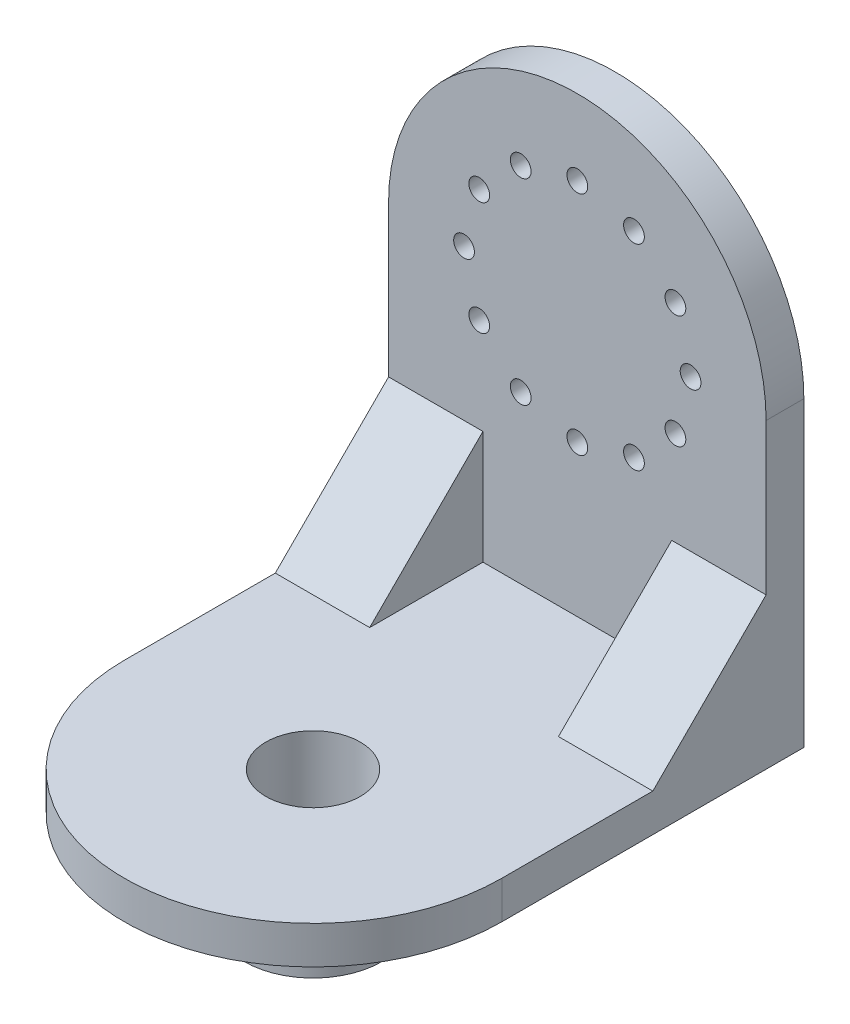
ISO-10303-21;
HEADER;
FILE_DESCRIPTION(('STEP AP214'),'2;1');
FILE_NAME('part.step','',(''),(''),'','','');
FILE_SCHEMA(('AUTOMOTIVE_DESIGN { 1 0 10303 214 1 1 1 1 }'));
ENDSEC;
DATA;
#1=APPLICATION_CONTEXT('core data for automotive mechanical design processes');
#2=APPLICATION_PROTOCOL_DEFINITION('international standard','automotive_design',2000,#1);
#3=PRODUCT_CONTEXT('',#1,'mechanical');
#4=PRODUCT('Part','Part','',(#3));
#5=PRODUCT_RELATED_PRODUCT_CATEGORY('part','',(#4));
#6=PRODUCT_DEFINITION_FORMATION('','',#4);
#7=PRODUCT_DEFINITION_CONTEXT('part definition',#1,'design');
#8=PRODUCT_DEFINITION('design','',#6,#7);
#9=PRODUCT_DEFINITION_SHAPE('','',#8);
#10=(LENGTH_UNIT() NAMED_UNIT(*) SI_UNIT(.MILLI.,.METRE.));
#11=(NAMED_UNIT(*) PLANE_ANGLE_UNIT() SI_UNIT($,.RADIAN.));
#12=(NAMED_UNIT(*) SI_UNIT($,.STERADIAN.) SOLID_ANGLE_UNIT());
#13=UNCERTAINTY_MEASURE_WITH_UNIT(LENGTH_MEASURE(1.E-05),#10,'distance_accuracy_value','');
#14=(GEOMETRIC_REPRESENTATION_CONTEXT(3) GLOBAL_UNCERTAINTY_ASSIGNED_CONTEXT((#13)) GLOBAL_UNIT_ASSIGNED_CONTEXT((#10,
#11,#12)) REPRESENTATION_CONTEXT('',''));
#15=CARTESIAN_POINT('',(0.,0.,0.));
#16=DIRECTION('',(0.,0.,1.));
#17=DIRECTION('',(1.,0.,0.));
#18=AXIS2_PLACEMENT_3D('',#15,#16,#17);
#19=CARTESIAN_POINT('',(0.,0.,10.));
#20=DIRECTION('',(0.,0.,1.));
#21=DIRECTION('',(1.,0.,0.));
#22=AXIS2_PLACEMENT_3D('',#19,#20,#21);
#23=PLANE('',#22);
#24=CARTESIAN_POINT('',(25.9807621135331,15.0000000000001,10.));
#25=DIRECTION('',(0.,0.,1.));
#26=DIRECTION('',(1.,0.,0.));
#27=AXIS2_PLACEMENT_3D('',#24,#25,#26);
#28=CIRCLE('',#27,2.75);
#29=CARTESIAN_POINT('',(28.7307621135331,15.0000000000001,10.));
#30=VERTEX_POINT('',#29);
#31=EDGE_CURVE('E329',#30,#30,#28,.T.);
#32=ORIENTED_EDGE('',*,*,#31,.F.);
#33=EDGE_LOOP('',(#32));
#34=FACE_BOUND('',#33,.T.);
#35=CARTESIAN_POINT('',(14.9999999999998,-25.9807621135332,10.));
#36=DIRECTION('',(0.,0.,1.));
#37=DIRECTION('',(-1.,0.,0.));
#38=AXIS2_PLACEMENT_3D('',#35,#36,#37);
#39=CIRCLE('',#38,2.75);
#40=CARTESIAN_POINT('',(12.2499999999998,-25.9807621135332,10.));
#41=VERTEX_POINT('',#40);
#42=EDGE_CURVE('E333',#41,#41,#39,.T.);
#43=ORIENTED_EDGE('',*,*,#42,.F.);
#44=EDGE_LOOP('',(#43));
#45=FACE_BOUND('',#44,.T.);
#46=CARTESIAN_POINT('',(25.9807621135331,-15.0000000000001,10.));
#47=DIRECTION('',(0.,0.,1.));
#48=DIRECTION('',(-1.,0.,0.));
#49=AXIS2_PLACEMENT_3D('',#46,#47,#48);
#50=CIRCLE('',#49,2.75);
#51=CARTESIAN_POINT('',(23.2307621135331,-15.0000000000001,10.));
#52=VERTEX_POINT('',#51);
#53=EDGE_CURVE('E337',#52,#52,#50,.T.);
#54=ORIENTED_EDGE('',*,*,#53,.F.);
#55=EDGE_LOOP('',(#54));
#56=FACE_BOUND('',#55,.T.);
#57=CARTESIAN_POINT('',(-14.9999999999998,25.9807621135332,10.));
#58=DIRECTION('',(0.,0.,1.));
#59=DIRECTION('',(-1.,0.,0.));
#60=AXIS2_PLACEMENT_3D('',#57,#58,#59);
#61=CIRCLE('',#60,2.75);
#62=CARTESIAN_POINT('',(-17.7499999999998,25.9807621135332,10.));
#63=VERTEX_POINT('',#62);
#64=EDGE_CURVE('E341',#63,#63,#61,.T.);
#65=ORIENTED_EDGE('',*,*,#64,.F.);
#66=EDGE_LOOP('',(#65));
#67=FACE_BOUND('',#66,.T.);
#68=CARTESIAN_POINT('',(30.,0.,10.));
#69=DIRECTION('',(0.,0.,1.));
#70=DIRECTION('',(1.,0.,0.));
#71=AXIS2_PLACEMENT_3D('',#68,#69,#70);
#72=CIRCLE('',#71,2.75);
#73=CARTESIAN_POINT('',(32.75,0.,10.));
#74=VERTEX_POINT('',#73);
#75=EDGE_CURVE('E316',#74,#74,#72,.T.);
#76=ORIENTED_EDGE('',*,*,#75,.F.);
#77=EDGE_LOOP('',(#76));
#78=FACE_BOUND('',#77,.T.);
#79=CARTESIAN_POINT('',(0.,-30.,10.));
#80=DIRECTION('',(0.,0.,1.));
#81=DIRECTION('',(1.,0.,0.));
#82=AXIS2_PLACEMENT_3D('',#79,#80,#81);
#83=CIRCLE('',#82,2.75);
#84=CARTESIAN_POINT('',(2.75,-30.,10.));
#85=VERTEX_POINT('',#84);
#86=EDGE_CURVE('E317',#85,#85,#83,.T.);
#87=ORIENTED_EDGE('',*,*,#86,.F.);
#88=EDGE_LOOP('',(#87));
#89=FACE_BOUND('',#88,.T.);
#90=CARTESIAN_POINT('',(-30.,0.,10.));
#91=DIRECTION('',(0.,0.,1.));
#92=DIRECTION('',(1.,0.,0.));
#93=AXIS2_PLACEMENT_3D('',#90,#91,#92);
#94=CIRCLE('',#93,2.75);
#95=CARTESIAN_POINT('',(-27.25,0.,10.));
#96=VERTEX_POINT('',#95);
#97=EDGE_CURVE('E321',#96,#96,#94,.T.);
#98=ORIENTED_EDGE('',*,*,#97,.F.);
#99=EDGE_LOOP('',(#98));
#100=FACE_BOUND('',#99,.T.);
#101=CARTESIAN_POINT('',(14.9999999999998,25.9807621135332,10.));
#102=DIRECTION('',(0.,0.,1.));
#103=DIRECTION('',(1.,0.,0.));
#104=AXIS2_PLACEMENT_3D('',#101,#102,#103);
#105=CIRCLE('',#104,2.75);
#106=CARTESIAN_POINT('',(17.7499999999998,25.9807621135332,10.));
#107=VERTEX_POINT('',#106);
#108=EDGE_CURVE('E325',#107,#107,#105,.T.);
#109=ORIENTED_EDGE('',*,*,#108,.F.);
#110=EDGE_LOOP('',(#109));
#111=FACE_BOUND('',#110,.T.);
#112=CARTESIAN_POINT('',(-25.9807621135331,15.0000000000001,10.));
#113=DIRECTION('',(0.,0.,1.));
#114=DIRECTION('',(-1.,0.,0.));
#115=AXIS2_PLACEMENT_3D('',#112,#113,#114);
#116=CIRCLE('',#115,2.75);
#117=CARTESIAN_POINT('',(-28.7307621135331,15.0000000000001,10.));
#118=VERTEX_POINT('',#117);
#119=EDGE_CURVE('E345',#118,#118,#116,.T.);
#120=ORIENTED_EDGE('',*,*,#119,.F.);
#121=EDGE_LOOP('',(#120));
#122=FACE_BOUND('',#121,.T.);
#123=CARTESIAN_POINT('',(-25.9807621135331,-15.0000000000001,10.));
#124=DIRECTION('',(0.,0.,1.));
#125=DIRECTION('',(1.,0.,0.));
#126=AXIS2_PLACEMENT_3D('',#123,#124,#125);
#127=CIRCLE('',#126,2.75);
#128=CARTESIAN_POINT('',(-23.2307621135331,-15.0000000000001,10.));
#129=VERTEX_POINT('',#128);
#130=EDGE_CURVE('E353',#129,#129,#127,.T.);
#131=ORIENTED_EDGE('',*,*,#130,.F.);
#132=EDGE_LOOP('',(#131));
#133=FACE_BOUND('',#132,.T.);
#134=CARTESIAN_POINT('',(-14.9999999999998,-25.9807621135332,10.));
#135=DIRECTION('',(0.,0.,1.));
#136=DIRECTION('',(1.,0.,0.));
#137=AXIS2_PLACEMENT_3D('',#134,#135,#136);
#138=CIRCLE('',#137,2.75);
#139=CARTESIAN_POINT('',(-12.2499999999998,-25.9807621135332,10.));
#140=VERTEX_POINT('',#139);
#141=EDGE_CURVE('E349',#140,#140,#138,.T.);
#142=ORIENTED_EDGE('',*,*,#141,.F.);
#143=EDGE_LOOP('',(#142));
#144=FACE_BOUND('',#143,.T.);
#145=CARTESIAN_POINT('',(0.,30.,10.));
#146=DIRECTION('',(0.,0.,1.));
#147=DIRECTION('',(1.,0.,0.));
#148=AXIS2_PLACEMENT_3D('',#145,#146,#147);
#149=CIRCLE('',#148,2.75);
#150=CARTESIAN_POINT('',(2.75,30.,10.));
#151=VERTEX_POINT('',#150);
#152=EDGE_CURVE('E139',#151,#151,#149,.T.);
#153=ORIENTED_EDGE('',*,*,#152,.F.);
#154=EDGE_LOOP('',(#153));
#155=FACE_BOUND('',#154,.T.);
#156=DIRECTION('',(1.,0.,0.));
#157=VECTOR('',#156,1.);
#158=CARTESIAN_POINT('',(25.,-40.,10.));
#159=LINE('',#158,#157);
#160=CARTESIAN_POINT('',(25.,-40.,10.));
#161=VERTEX_POINT('',#160);
#162=CARTESIAN_POINT('',(50.,-40.,10.));
#163=VERTEX_POINT('',#162);
#164=EDGE_CURVE('E198',#161,#163,#159,.T.);
#165=ORIENTED_EDGE('',*,*,#164,.T.);
#166=DIRECTION('',(0.,1.,0.));
#167=VECTOR('',#166,1.);
#168=CARTESIAN_POINT('',(50.,-80.,10.));
#169=LINE('',#168,#167);
#170=CARTESIAN_POINT('',(50.,0.,10.));
#171=VERTEX_POINT('',#170);
#172=EDGE_CURVE('E69',#163,#171,#169,.T.);
#173=ORIENTED_EDGE('',*,*,#172,.T.);
#174=CARTESIAN_POINT('',(0.,0.,10.));
#175=DIRECTION('',(0.,0.,1.));
#176=DIRECTION('',(1.,0.,0.));
#177=AXIS2_PLACEMENT_3D('',#174,#175,#176);
#178=CIRCLE('',#177,50.);
#179=CARTESIAN_POINT('',(-50.,0.,10.));
#180=VERTEX_POINT('',#179);
#181=EDGE_CURVE('E100',#171,#180,#178,.T.);
#182=ORIENTED_EDGE('',*,*,#181,.T.);
#183=DIRECTION('',(0.,-1.,0.));
#184=VECTOR('',#183,1.);
#185=CARTESIAN_POINT('',(-50.,0.,10.));
#186=LINE('',#185,#184);
#187=CARTESIAN_POINT('',(-50.,-40.,10.));
#188=VERTEX_POINT('',#187);
#189=EDGE_CURVE('E246',#180,#188,#186,.T.);
#190=ORIENTED_EDGE('',*,*,#189,.T.);
#191=DIRECTION('',(-1.,0.,0.));
#192=VECTOR('',#191,1.);
#193=CARTESIAN_POINT('',(-25.,-40.,10.));
#194=LINE('',#193,#192);
#195=CARTESIAN_POINT('',(-25.,-40.,10.));
#196=VERTEX_POINT('',#195);
#197=EDGE_CURVE('E217',#196,#188,#194,.T.);
#198=ORIENTED_EDGE('',*,*,#197,.F.);
#199=DIRECTION('',(0.,-1.,0.));
#200=VECTOR('',#199,1.);
#201=CARTESIAN_POINT('',(-25.,-70.,9.99999999999999));
#202=LINE('',#201,#200);
#203=CARTESIAN_POINT('',(-25.,-70.,9.99999999999999));
#204=VERTEX_POINT('',#203);
#205=EDGE_CURVE('E201',#196,#204,#202,.T.);
#206=ORIENTED_EDGE('',*,*,#205,.T.);
#207=DIRECTION('',(1.,0.,0.));
#208=VECTOR('',#207,1.);
#209=CARTESIAN_POINT('',(50.,-70.,10.));
#210=LINE('',#209,#208);
#211=CARTESIAN_POINT('',(25.,-70.,9.99999999999999));
#212=VERTEX_POINT('',#211);
#213=EDGE_CURVE('E225',#204,#212,#210,.T.);
#214=ORIENTED_EDGE('',*,*,#213,.T.);
#215=DIRECTION('',(0.,1.,0.));
#216=VECTOR('',#215,1.);
#217=CARTESIAN_POINT('',(25.,-70.,9.99999999999999));
#218=LINE('',#217,#216);
#219=EDGE_CURVE('E188',#212,#161,#218,.T.);
#220=ORIENTED_EDGE('',*,*,#219,.T.);
#221=EDGE_LOOP('',(#165,#173,#182,#190,#198,#206,#214,#220));
#222=FACE_BOUND('',#221,.T.);
#223=ADVANCED_FACE('F45',(#34,#45,#56,#67,#78,#89,#100,#111,#122,#133,#144,#155,#222),#23,.T.);
#224=CARTESIAN_POINT('',(0.,0.,10.));
#225=DIRECTION('',(0.,0.,-1.));
#226=DIRECTION('',(-1.,0.,0.));
#227=AXIS2_PLACEMENT_3D('',#224,#225,#226);
#228=CYLINDRICAL_SURFACE('',#227,50.);
#229=CARTESIAN_POINT('',(0.,0.,0.));
#230=DIRECTION('',(0.,0.,1.));
#231=DIRECTION('',(1.,0.,0.));
#232=AXIS2_PLACEMENT_3D('',#229,#230,#231);
#233=CIRCLE('',#232,50.);
#234=CARTESIAN_POINT('',(50.,0.,0.));
#235=VERTEX_POINT('',#234);
#236=CARTESIAN_POINT('',(-50.,0.,0.));
#237=VERTEX_POINT('',#236);
#238=EDGE_CURVE('E106',#235,#237,#233,.T.);
#239=ORIENTED_EDGE('',*,*,#238,.T.);
#240=DIRECTION('',(0.,0.,-1.));
#241=VECTOR('',#240,1.);
#242=CARTESIAN_POINT('',(-50.,0.,10.));
#243=LINE('',#242,#241);
#244=EDGE_CURVE('E54',#180,#237,#243,.T.);
#245=ORIENTED_EDGE('',*,*,#244,.F.);
#246=ORIENTED_EDGE('',*,*,#181,.F.);
#247=DIRECTION('',(0.,0.,-1.));
#248=VECTOR('',#247,1.);
#249=CARTESIAN_POINT('',(50.,0.,10.));
#250=LINE('',#249,#248);
#251=EDGE_CURVE('E91',#171,#235,#250,.T.);
#252=ORIENTED_EDGE('',*,*,#251,.T.);
#253=EDGE_LOOP('',(#239,#245,#246,#252));
#254=FACE_BOUND('',#253,.T.);
#255=ADVANCED_FACE('F47',(#254),#228,.T.);
#256=CARTESIAN_POINT('',(-50.,0.,10.));
#257=DIRECTION('',(1.,0.,0.));
#258=DIRECTION('',(0.,0.,-1.));
#259=AXIS2_PLACEMENT_3D('',#256,#257,#258);
#260=PLANE('',#259);
#261=DIRECTION('',(0.,-1.,0.));
#262=VECTOR('',#261,1.);
#263=CARTESIAN_POINT('',(-50.,0.,0.));
#264=LINE('',#263,#262);
#265=CARTESIAN_POINT('',(-50.,-80.,0.));
#266=VERTEX_POINT('',#265);
#267=EDGE_CURVE('E110',#237,#266,#264,.T.);
#268=ORIENTED_EDGE('',*,*,#267,.T.);
#269=DIRECTION('',(0.,0.,-1.));
#270=VECTOR('',#269,1.);
#271=CARTESIAN_POINT('',(-50.,-80.,10.));
#272=LINE('',#271,#270);
#273=CARTESIAN_POINT('',(-50.,-80.,80.));
#274=VERTEX_POINT('',#273);
#275=EDGE_CURVE('E128',#274,#266,#272,.T.);
#276=ORIENTED_EDGE('',*,*,#275,.F.);
#277=DIRECTION('',(0.,-1.,0.));
#278=VECTOR('',#277,1.);
#279=CARTESIAN_POINT('',(-50.,-70.,80.));
#280=LINE('',#279,#278);
#281=CARTESIAN_POINT('',(-50.,-70.,80.));
#282=VERTEX_POINT('',#281);
#283=EDGE_CURVE('E113',#282,#274,#280,.T.);
#284=ORIENTED_EDGE('',*,*,#283,.F.);
#285=DIRECTION('',(0.,0.,-1.));
#286=VECTOR('',#285,1.);
#287=CARTESIAN_POINT('',(-50.,-70.,80.));
#288=LINE('',#287,#286);
#289=CARTESIAN_POINT('',(-50.,-70.,40.));
#290=VERTEX_POINT('',#289);
#291=EDGE_CURVE('E236',#282,#290,#288,.T.);
#292=ORIENTED_EDGE('',*,*,#291,.T.);
#293=DIRECTION('',(0.,0.707106781186547,-0.707106781186548));
#294=VECTOR('',#293,1.);
#295=CARTESIAN_POINT('',(-50.,-40.,10.));
#296=LINE('',#295,#294);
#297=EDGE_CURVE('E197',#290,#188,#296,.T.);
#298=ORIENTED_EDGE('',*,*,#297,.T.);
#299=ORIENTED_EDGE('',*,*,#189,.F.);
#300=ORIENTED_EDGE('',*,*,#244,.T.);
#301=EDGE_LOOP('',(#268,#276,#284,#292,#298,#299,#300));
#302=FACE_BOUND('',#301,.T.);
#303=ADVANCED_FACE('F257',(#302),#260,.F.);
#304=CARTESIAN_POINT('',(-50.,-80.,10.));
#305=DIRECTION('',(0.,1.,0.));
#306=DIRECTION('',(0.,0.,1.));
#307=AXIS2_PLACEMENT_3D('',#304,#305,#306);
#308=PLANE('',#307);
#309=CARTESIAN_POINT('',(0.,-80.,80.));
#310=DIRECTION('',(0.,1.,0.));
#311=DIRECTION('',(0.,0.,1.));
#312=AXIS2_PLACEMENT_3D('',#309,#310,#311);
#313=CIRCLE('',#312,18.25);
#314=CARTESIAN_POINT('',(0.,-80.,98.25));
#315=VERTEX_POINT('',#314);
#316=EDGE_CURVE('E12',#315,#315,#313,.F.);
#317=ORIENTED_EDGE('',*,*,#316,.F.);
#318=EDGE_LOOP('',(#317));
#319=FACE_BOUND('',#318,.T.);
#320=DIRECTION('',(1.,0.,0.));
#321=VECTOR('',#320,1.);
#322=CARTESIAN_POINT('',(-50.,-80.,0.));
#323=LINE('',#322,#321);
#324=CARTESIAN_POINT('',(50.,-80.,0.));
#325=VERTEX_POINT('',#324);
#326=EDGE_CURVE('E101',#266,#325,#323,.T.);
#327=ORIENTED_EDGE('',*,*,#326,.T.);
#328=DIRECTION('',(0.,0.,-1.));
#329=VECTOR('',#328,1.);
#330=CARTESIAN_POINT('',(50.,-80.,10.));
#331=LINE('',#330,#329);
#332=CARTESIAN_POINT('',(50.,-80.,80.));
#333=VERTEX_POINT('',#332);
#334=EDGE_CURVE('E95',#333,#325,#331,.T.);
#335=ORIENTED_EDGE('',*,*,#334,.F.);
#336=CARTESIAN_POINT('',(0.,-80.,80.));
#337=DIRECTION('',(0.,-1.,0.));
#338=DIRECTION('',(0.,0.,-1.));
#339=AXIS2_PLACEMENT_3D('',#336,#337,#338);
#340=CIRCLE('',#339,50.);
#341=EDGE_CURVE('E221',#333,#274,#340,.T.);
#342=ORIENTED_EDGE('',*,*,#341,.T.);
#343=ORIENTED_EDGE('',*,*,#275,.T.);
#344=EDGE_LOOP('',(#327,#335,#342,#343));
#345=FACE_BOUND('',#344,.T.);
#346=ADVANCED_FACE('F305',(#319,#345),#308,.F.);
#347=CARTESIAN_POINT('',(50.,-80.,10.));
#348=DIRECTION('',(-1.,0.,0.));
#349=DIRECTION('',(0.,0.,1.));
#350=AXIS2_PLACEMENT_3D('',#347,#348,#349);
#351=PLANE('',#350);
#352=ORIENTED_EDGE('',*,*,#172,.F.);
#353=DIRECTION('',(0.,-0.707106781186547,0.707106781186548));
#354=VECTOR('',#353,1.);
#355=CARTESIAN_POINT('',(50.,-40.,10.));
#356=LINE('',#355,#354);
#357=CARTESIAN_POINT('',(50.,-70.,40.));
#358=VERTEX_POINT('',#357);
#359=EDGE_CURVE('E61',#163,#358,#356,.T.);
#360=ORIENTED_EDGE('',*,*,#359,.T.);
#361=DIRECTION('',(0.,0.,1.));
#362=VECTOR('',#361,1.);
#363=CARTESIAN_POINT('',(50.,-70.,10.));
#364=LINE('',#363,#362);
#365=CARTESIAN_POINT('',(50.,-70.,80.));
#366=VERTEX_POINT('',#365);
#367=EDGE_CURVE('E229',#358,#366,#364,.T.);
#368=ORIENTED_EDGE('',*,*,#367,.T.);
#369=DIRECTION('',(0.,-1.,0.));
#370=VECTOR('',#369,1.);
#371=CARTESIAN_POINT('',(50.,-70.,80.));
#372=LINE('',#371,#370);
#373=EDGE_CURVE('E119',#366,#333,#372,.T.);
#374=ORIENTED_EDGE('',*,*,#373,.T.);
#375=ORIENTED_EDGE('',*,*,#334,.T.);
#376=DIRECTION('',(0.,1.,0.));
#377=VECTOR('',#376,1.);
#378=CARTESIAN_POINT('',(50.,-80.,0.));
#379=LINE('',#378,#377);
#380=EDGE_CURVE('E88',#325,#235,#379,.T.);
#381=ORIENTED_EDGE('',*,*,#380,.T.);
#382=ORIENTED_EDGE('',*,*,#251,.F.);
#383=EDGE_LOOP('',(#352,#360,#368,#374,#375,#381,#382));
#384=FACE_BOUND('',#383,.T.);
#385=ADVANCED_FACE('F90',(#384),#351,.F.);
#386=CARTESIAN_POINT('',(0.,0.,0.));
#387=DIRECTION('',(0.,0.,1.));
#388=DIRECTION('',(1.,0.,0.));
#389=AXIS2_PLACEMENT_3D('',#386,#387,#388);
#390=PLANE('',#389);
#391=CARTESIAN_POINT('',(25.9807621135331,15.0000000000001,0.));
#392=DIRECTION('',(0.,0.,1.));
#393=DIRECTION('',(1.,0.,0.));
#394=AXIS2_PLACEMENT_3D('',#391,#392,#393);
#395=CIRCLE('',#394,2.75);
#396=CARTESIAN_POINT('',(28.7307621135331,15.0000000000001,0.));
#397=VERTEX_POINT('',#396);
#398=EDGE_CURVE('E178',#397,#397,#395,.T.);
#399=ORIENTED_EDGE('',*,*,#398,.T.);
#400=EDGE_LOOP('',(#399));
#401=FACE_BOUND('',#400,.T.);
#402=CARTESIAN_POINT('',(14.9999999999998,-25.9807621135332,0.));
#403=DIRECTION('',(0.,0.,1.));
#404=DIRECTION('',(1.,0.,0.));
#405=AXIS2_PLACEMENT_3D('',#402,#403,#404);
#406=CIRCLE('',#405,2.75);
#407=CARTESIAN_POINT('',(17.7499999999998,-25.9807621135332,0.));
#408=VERTEX_POINT('',#407);
#409=EDGE_CURVE('E175',#408,#408,#406,.T.);
#410=ORIENTED_EDGE('',*,*,#409,.T.);
#411=EDGE_LOOP('',(#410));
#412=FACE_BOUND('',#411,.T.);
#413=CARTESIAN_POINT('',(25.9807621135331,-15.0000000000001,0.));
#414=DIRECTION('',(0.,0.,1.));
#415=DIRECTION('',(1.,0.,0.));
#416=AXIS2_PLACEMENT_3D('',#413,#414,#415);
#417=CIRCLE('',#416,2.75);
#418=CARTESIAN_POINT('',(28.7307621135331,-15.0000000000001,0.));
#419=VERTEX_POINT('',#418);
#420=EDGE_CURVE('E171',#419,#419,#417,.T.);
#421=ORIENTED_EDGE('',*,*,#420,.T.);
#422=EDGE_LOOP('',(#421));
#423=FACE_BOUND('',#422,.T.);
#424=CARTESIAN_POINT('',(-14.9999999999998,25.9807621135332,0.));
#425=DIRECTION('',(0.,0.,1.));
#426=DIRECTION('',(1.,0.,0.));
#427=AXIS2_PLACEMENT_3D('',#424,#425,#426);
#428=CIRCLE('',#427,2.75);
#429=CARTESIAN_POINT('',(-12.2499999999998,25.9807621135332,0.));
#430=VERTEX_POINT('',#429);
#431=EDGE_CURVE('E167',#430,#430,#428,.T.);
#432=ORIENTED_EDGE('',*,*,#431,.T.);
#433=EDGE_LOOP('',(#432));
#434=FACE_BOUND('',#433,.T.);
#435=CARTESIAN_POINT('',(30.,0.,0.));
#436=DIRECTION('',(0.,0.,1.));
#437=DIRECTION('',(1.,0.,0.));
#438=AXIS2_PLACEMENT_3D('',#435,#436,#437);
#439=CIRCLE('',#438,2.75);
#440=CARTESIAN_POINT('',(32.75,0.,0.));
#441=VERTEX_POINT('',#440);
#442=EDGE_CURVE('E163',#441,#441,#439,.T.);
#443=ORIENTED_EDGE('',*,*,#442,.T.);
#444=EDGE_LOOP('',(#443));
#445=FACE_BOUND('',#444,.T.);
#446=CARTESIAN_POINT('',(0.,-30.,0.));
#447=DIRECTION('',(0.,0.,1.));
#448=DIRECTION('',(1.,0.,0.));
#449=AXIS2_PLACEMENT_3D('',#446,#447,#448);
#450=CIRCLE('',#449,2.75);
#451=CARTESIAN_POINT('',(2.75,-30.,0.));
#452=VERTEX_POINT('',#451);
#453=EDGE_CURVE('E159',#452,#452,#450,.T.);
#454=ORIENTED_EDGE('',*,*,#453,.T.);
#455=EDGE_LOOP('',(#454));
#456=FACE_BOUND('',#455,.T.);
#457=CARTESIAN_POINT('',(-30.,0.,0.));
#458=DIRECTION('',(0.,0.,1.));
#459=DIRECTION('',(1.,0.,0.));
#460=AXIS2_PLACEMENT_3D('',#457,#458,#459);
#461=CIRCLE('',#460,2.75);
#462=CARTESIAN_POINT('',(-27.25,0.,0.));
#463=VERTEX_POINT('',#462);
#464=EDGE_CURVE('E155',#463,#463,#461,.T.);
#465=ORIENTED_EDGE('',*,*,#464,.T.);
#466=EDGE_LOOP('',(#465));
#467=FACE_BOUND('',#466,.T.);
#468=CARTESIAN_POINT('',(14.9999999999998,25.9807621135332,0.));
#469=DIRECTION('',(0.,0.,1.));
#470=DIRECTION('',(1.,0.,0.));
#471=AXIS2_PLACEMENT_3D('',#468,#469,#470);
#472=CIRCLE('',#471,2.75);
#473=CARTESIAN_POINT('',(17.7499999999998,25.9807621135332,0.));
#474=VERTEX_POINT('',#473);
#475=EDGE_CURVE('E151',#474,#474,#472,.T.);
#476=ORIENTED_EDGE('',*,*,#475,.T.);
#477=EDGE_LOOP('',(#476));
#478=FACE_BOUND('',#477,.T.);
#479=CARTESIAN_POINT('',(-25.9807621135331,15.0000000000001,0.));
#480=DIRECTION('',(0.,0.,1.));
#481=DIRECTION('',(1.,0.,0.));
#482=AXIS2_PLACEMENT_3D('',#479,#480,#481);
#483=CIRCLE('',#482,2.75);
#484=CARTESIAN_POINT('',(-23.2307621135331,15.0000000000001,0.));
#485=VERTEX_POINT('',#484);
#486=EDGE_CURVE('E147',#485,#485,#483,.T.);
#487=ORIENTED_EDGE('',*,*,#486,.T.);
#488=EDGE_LOOP('',(#487));
#489=FACE_BOUND('',#488,.T.);
#490=CARTESIAN_POINT('',(-25.9807621135331,-15.0000000000001,0.));
#491=DIRECTION('',(0.,0.,1.));
#492=DIRECTION('',(1.,0.,0.));
#493=AXIS2_PLACEMENT_3D('',#490,#491,#492);
#494=CIRCLE('',#493,2.75);
#495=CARTESIAN_POINT('',(-23.2307621135331,-15.0000000000001,0.));
#496=VERTEX_POINT('',#495);
#497=EDGE_CURVE('E143',#496,#496,#494,.T.);
#498=ORIENTED_EDGE('',*,*,#497,.T.);
#499=EDGE_LOOP('',(#498));
#500=FACE_BOUND('',#499,.T.);
#501=CARTESIAN_POINT('',(-14.9999999999998,-25.9807621135332,0.));
#502=DIRECTION('',(0.,0.,1.));
#503=DIRECTION('',(1.,0.,0.));
#504=AXIS2_PLACEMENT_3D('',#501,#502,#503);
#505=CIRCLE('',#504,2.75);
#506=CARTESIAN_POINT('',(-12.2499999999998,-25.9807621135332,0.));
#507=VERTEX_POINT('',#506);
#508=EDGE_CURVE('E138',#507,#507,#505,.T.);
#509=ORIENTED_EDGE('',*,*,#508,.T.);
#510=EDGE_LOOP('',(#509));
#511=FACE_BOUND('',#510,.T.);
#512=CARTESIAN_POINT('',(0.,30.,0.));
#513=DIRECTION('',(0.,0.,1.));
#514=DIRECTION('',(1.,0.,0.));
#515=AXIS2_PLACEMENT_3D('',#512,#513,#514);
#516=CIRCLE('',#515,2.75);
#517=CARTESIAN_POINT('',(2.75,30.,0.));
#518=VERTEX_POINT('',#517);
#519=EDGE_CURVE('E134',#518,#518,#516,.T.);
#520=ORIENTED_EDGE('',*,*,#519,.T.);
#521=EDGE_LOOP('',(#520));
#522=FACE_BOUND('',#521,.T.);
#523=ORIENTED_EDGE('',*,*,#238,.F.);
#524=ORIENTED_EDGE('',*,*,#380,.F.);
#525=ORIENTED_EDGE('',*,*,#326,.F.);
#526=ORIENTED_EDGE('',*,*,#267,.F.);
#527=EDGE_LOOP('',(#523,#524,#525,#526));
#528=FACE_BOUND('',#527,.T.);
#529=ADVANCED_FACE('F109',(#401,#412,#423,#434,#445,#456,#467,#478,#489,#500,#511,#522,#528),
#390,.F.);
#530=CARTESIAN_POINT('',(0.,-70.,80.));
#531=DIRECTION('',(0.,-1.,0.));
#532=DIRECTION('',(0.,0.,-1.));
#533=AXIS2_PLACEMENT_3D('',#530,#531,#532);
#534=CYLINDRICAL_SURFACE('',#533,50.);
#535=ORIENTED_EDGE('',*,*,#341,.F.);
#536=ORIENTED_EDGE('',*,*,#373,.F.);
#537=CARTESIAN_POINT('',(0.,-70.,80.));
#538=DIRECTION('',(0.,-1.,0.));
#539=DIRECTION('',(0.,0.,-1.));
#540=AXIS2_PLACEMENT_3D('',#537,#538,#539);
#541=CIRCLE('',#540,50.);
#542=EDGE_CURVE('E232',#366,#282,#541,.T.);
#543=ORIENTED_EDGE('',*,*,#542,.T.);
#544=ORIENTED_EDGE('',*,*,#283,.T.);
#545=EDGE_LOOP('',(#535,#536,#543,#544));
#546=FACE_BOUND('',#545,.T.);
#547=ADVANCED_FACE('F303',(#546),#534,.T.);
#548=CARTESIAN_POINT('',(0.,-70.,80.));
#549=DIRECTION('',(0.,-1.,0.));
#550=DIRECTION('',(0.,0.,-1.));
#551=AXIS2_PLACEMENT_3D('',#548,#549,#550);
#552=PLANE('',#551);
#553=CARTESIAN_POINT('',(0.,-70.,80.));
#554=DIRECTION('',(0.,-1.,0.));
#555=DIRECTION('',(0.,0.,-1.));
#556=AXIS2_PLACEMENT_3D('',#553,#554,#555);
#557=CIRCLE('',#556,12.5);
#558=CARTESIAN_POINT('',(0.,-70.,67.5));
#559=VERTEX_POINT('',#558);
#560=EDGE_CURVE('E368',#559,#559,#557,.T.);
#561=ORIENTED_EDGE('',*,*,#560,.T.);
#562=EDGE_LOOP('',(#561));
#563=FACE_BOUND('',#562,.T.);
#564=ORIENTED_EDGE('',*,*,#367,.F.);
#565=DIRECTION('',(1.,0.,0.));
#566=VECTOR('',#565,1.);
#567=CARTESIAN_POINT('',(25.,-70.,40.));
#568=LINE('',#567,#566);
#569=CARTESIAN_POINT('',(25.,-70.,40.));
#570=VERTEX_POINT('',#569);
#571=EDGE_CURVE('E194',#570,#358,#568,.T.);
#572=ORIENTED_EDGE('',*,*,#571,.F.);
#573=DIRECTION('',(0.,0.,-1.));
#574=VECTOR('',#573,1.);
#575=CARTESIAN_POINT('',(25.,-70.,40.));
#576=LINE('',#575,#574);
#577=EDGE_CURVE('E184',#570,#212,#576,.T.);
#578=ORIENTED_EDGE('',*,*,#577,.T.);
#579=ORIENTED_EDGE('',*,*,#213,.F.);
#580=DIRECTION('',(0.,0.,1.));
#581=VECTOR('',#580,1.);
#582=CARTESIAN_POINT('',(-25.,-70.,40.));
#583=LINE('',#582,#581);
#584=CARTESIAN_POINT('',(-25.,-70.,40.));
#585=VERTEX_POINT('',#584);
#586=EDGE_CURVE('E205',#204,#585,#583,.T.);
#587=ORIENTED_EDGE('',*,*,#586,.T.);
#588=DIRECTION('',(-1.,0.,0.));
#589=VECTOR('',#588,1.);
#590=CARTESIAN_POINT('',(-25.,-70.,40.));
#591=LINE('',#590,#589);
#592=EDGE_CURVE('E213',#585,#290,#591,.T.);
#593=ORIENTED_EDGE('',*,*,#592,.T.);
#594=ORIENTED_EDGE('',*,*,#291,.F.);
#595=ORIENTED_EDGE('',*,*,#542,.F.);
#596=EDGE_LOOP('',(#564,#572,#578,#579,#587,#593,#594,#595));
#597=FACE_BOUND('',#596,.T.);
#598=ADVANCED_FACE('F270',(#563,#597),#552,.F.);
#599=CARTESIAN_POINT('',(-25.,-40.,10.));
#600=DIRECTION('',(0.,0.707106781186548,0.707106781186547));
#601=DIRECTION('',(0.,-0.707106781186547,0.707106781186548));
#602=AXIS2_PLACEMENT_3D('',#599,#600,#601);
#603=PLANE('',#602);
#604=ORIENTED_EDGE('',*,*,#297,.F.);
#605=ORIENTED_EDGE('',*,*,#592,.F.);
#606=DIRECTION('',(0.,0.707106781186547,-0.707106781186548));
#607=VECTOR('',#606,1.);
#608=CARTESIAN_POINT('',(-25.,-40.,10.));
#609=LINE('',#608,#607);
#610=EDGE_CURVE('E209',#585,#196,#609,.T.);
#611=ORIENTED_EDGE('',*,*,#610,.T.);
#612=ORIENTED_EDGE('',*,*,#197,.T.);
#613=EDGE_LOOP('',(#604,#605,#611,#612));
#614=FACE_BOUND('',#613,.T.);
#615=ADVANCED_FACE('F263',(#614),#603,.T.);
#616=CARTESIAN_POINT('',(-25.,0.,0.));
#617=DIRECTION('',(-1.,0.,0.));
#618=DIRECTION('',(0.,0.,1.));
#619=AXIS2_PLACEMENT_3D('',#616,#617,#618);
#620=PLANE('',#619);
#621=ORIENTED_EDGE('',*,*,#205,.F.);
#622=ORIENTED_EDGE('',*,*,#610,.F.);
#623=ORIENTED_EDGE('',*,*,#586,.F.);
#624=EDGE_LOOP('',(#621,#622,#623));
#625=FACE_BOUND('',#624,.T.);
#626=ADVANCED_FACE('F277',(#625),#620,.F.);
#627=CARTESIAN_POINT('',(25.,-40.,10.));
#628=DIRECTION('',(0.,0.707106781186548,0.707106781186547));
#629=DIRECTION('',(0.,-0.707106781186547,0.707106781186548));
#630=AXIS2_PLACEMENT_3D('',#627,#628,#629);
#631=PLANE('',#630);
#632=ORIENTED_EDGE('',*,*,#359,.F.);
#633=ORIENTED_EDGE('',*,*,#164,.F.);
#634=DIRECTION('',(0.,-0.707106781186547,0.707106781186548));
#635=VECTOR('',#634,1.);
#636=CARTESIAN_POINT('',(25.,-40.,10.));
#637=LINE('',#636,#635);
#638=EDGE_CURVE('E192',#161,#570,#637,.T.);
#639=ORIENTED_EDGE('',*,*,#638,.T.);
#640=ORIENTED_EDGE('',*,*,#571,.T.);
#641=EDGE_LOOP('',(#632,#633,#639,#640));
#642=FACE_BOUND('',#641,.T.);
#643=ADVANCED_FACE('F309',(#642),#631,.T.);
#644=CARTESIAN_POINT('',(25.,0.,0.));
#645=DIRECTION('',(1.,0.,0.));
#646=DIRECTION('',(0.,0.,-1.));
#647=AXIS2_PLACEMENT_3D('',#644,#645,#646);
#648=PLANE('',#647);
#649=ORIENTED_EDGE('',*,*,#577,.F.);
#650=ORIENTED_EDGE('',*,*,#638,.F.);
#651=ORIENTED_EDGE('',*,*,#219,.F.);
#652=EDGE_LOOP('',(#649,#650,#651));
#653=FACE_BOUND('',#652,.T.);
#654=ADVANCED_FACE('F437',(#653),#648,.F.);
#655=CARTESIAN_POINT('',(0.,30.,-15.));
#656=DIRECTION('',(0.,0.,1.));
#657=DIRECTION('',(1.,0.,0.));
#658=AXIS2_PLACEMENT_3D('',#655,#656,#657);
#659=CYLINDRICAL_SURFACE('',#658,2.75);
#660=ORIENTED_EDGE('',*,*,#152,.T.);
#661=EDGE_LOOP('',(#660));
#662=FACE_BOUND('',#661,.T.);
#663=ORIENTED_EDGE('',*,*,#519,.F.);
#664=EDGE_LOOP('',(#663));
#665=FACE_BOUND('',#664,.T.);
#666=ADVANCED_FACE('F444',(#662,#665),#659,.F.);
#667=CARTESIAN_POINT('',(-14.9999999999998,-25.9807621135332,-15.));
#668=DIRECTION('',(0.,0.,1.));
#669=DIRECTION('',(1.,0.,0.));
#670=AXIS2_PLACEMENT_3D('',#667,#668,#669);
#671=CYLINDRICAL_SURFACE('',#670,2.75);
#672=ORIENTED_EDGE('',*,*,#141,.T.);
#673=EDGE_LOOP('',(#672));
#674=FACE_BOUND('',#673,.T.);
#675=ORIENTED_EDGE('',*,*,#508,.F.);
#676=EDGE_LOOP('',(#675));
#677=FACE_BOUND('',#676,.T.);
#678=ADVANCED_FACE('F456',(#674,#677),#671,.F.);
#679=CARTESIAN_POINT('',(-25.9807621135331,-15.0000000000001,-15.));
#680=DIRECTION('',(0.,0.,1.));
#681=DIRECTION('',(1.,0.,0.));
#682=AXIS2_PLACEMENT_3D('',#679,#680,#681);
#683=CYLINDRICAL_SURFACE('',#682,2.75);
#684=ORIENTED_EDGE('',*,*,#130,.T.);
#685=EDGE_LOOP('',(#684));
#686=FACE_BOUND('',#685,.T.);
#687=ORIENTED_EDGE('',*,*,#497,.F.);
#688=EDGE_LOOP('',(#687));
#689=FACE_BOUND('',#688,.T.);
#690=ADVANCED_FACE('F466',(#686,#689),#683,.F.);
#691=CARTESIAN_POINT('',(-25.9807621135331,15.0000000000001,-15.));
#692=DIRECTION('',(0.,0.,1.));
#693=DIRECTION('',(1.,0.,0.));
#694=AXIS2_PLACEMENT_3D('',#691,#692,#693);
#695=CYLINDRICAL_SURFACE('',#694,2.75);
#696=ORIENTED_EDGE('',*,*,#119,.T.);
#697=EDGE_LOOP('',(#696));
#698=FACE_BOUND('',#697,.T.);
#699=ORIENTED_EDGE('',*,*,#486,.F.);
#700=EDGE_LOOP('',(#699));
#701=FACE_BOUND('',#700,.T.);
#702=ADVANCED_FACE('F476',(#698,#701),#695,.F.);
#703=CARTESIAN_POINT('',(14.9999999999998,25.9807621135332,-15.));
#704=DIRECTION('',(0.,0.,1.));
#705=DIRECTION('',(1.,0.,0.));
#706=AXIS2_PLACEMENT_3D('',#703,#704,#705);
#707=CYLINDRICAL_SURFACE('',#706,2.75);
#708=ORIENTED_EDGE('',*,*,#108,.T.);
#709=EDGE_LOOP('',(#708));
#710=FACE_BOUND('',#709,.T.);
#711=ORIENTED_EDGE('',*,*,#475,.F.);
#712=EDGE_LOOP('',(#711));
#713=FACE_BOUND('',#712,.T.);
#714=ADVANCED_FACE('F486',(#710,#713),#707,.F.);
#715=CARTESIAN_POINT('',(-30.,0.,-15.));
#716=DIRECTION('',(0.,0.,1.));
#717=DIRECTION('',(1.,0.,0.));
#718=AXIS2_PLACEMENT_3D('',#715,#716,#717);
#719=CYLINDRICAL_SURFACE('',#718,2.75);
#720=ORIENTED_EDGE('',*,*,#97,.T.);
#721=EDGE_LOOP('',(#720));
#722=FACE_BOUND('',#721,.T.);
#723=ORIENTED_EDGE('',*,*,#464,.F.);
#724=EDGE_LOOP('',(#723));
#725=FACE_BOUND('',#724,.T.);
#726=ADVANCED_FACE('F496',(#722,#725),#719,.F.);
#727=CARTESIAN_POINT('',(0.,-30.,-15.));
#728=DIRECTION('',(0.,0.,1.));
#729=DIRECTION('',(1.,0.,0.));
#730=AXIS2_PLACEMENT_3D('',#727,#728,#729);
#731=CYLINDRICAL_SURFACE('',#730,2.75);
#732=ORIENTED_EDGE('',*,*,#86,.T.);
#733=EDGE_LOOP('',(#732));
#734=FACE_BOUND('',#733,.T.);
#735=ORIENTED_EDGE('',*,*,#453,.F.);
#736=EDGE_LOOP('',(#735));
#737=FACE_BOUND('',#736,.T.);
#738=ADVANCED_FACE('F506',(#734,#737),#731,.F.);
#739=CARTESIAN_POINT('',(30.,0.,-15.));
#740=DIRECTION('',(0.,0.,1.));
#741=DIRECTION('',(1.,0.,0.));
#742=AXIS2_PLACEMENT_3D('',#739,#740,#741);
#743=CYLINDRICAL_SURFACE('',#742,2.75);
#744=ORIENTED_EDGE('',*,*,#75,.T.);
#745=EDGE_LOOP('',(#744));
#746=FACE_BOUND('',#745,.T.);
#747=ORIENTED_EDGE('',*,*,#442,.F.);
#748=EDGE_LOOP('',(#747));
#749=FACE_BOUND('',#748,.T.);
#750=ADVANCED_FACE('F516',(#746,#749),#743,.F.);
#751=CARTESIAN_POINT('',(-14.9999999999998,25.9807621135332,-15.));
#752=DIRECTION('',(0.,0.,1.));
#753=DIRECTION('',(1.,0.,0.));
#754=AXIS2_PLACEMENT_3D('',#751,#752,#753);
#755=CYLINDRICAL_SURFACE('',#754,2.75);
#756=ORIENTED_EDGE('',*,*,#64,.T.);
#757=EDGE_LOOP('',(#756));
#758=FACE_BOUND('',#757,.T.);
#759=ORIENTED_EDGE('',*,*,#431,.F.);
#760=EDGE_LOOP('',(#759));
#761=FACE_BOUND('',#760,.T.);
#762=ADVANCED_FACE('F526',(#758,#761),#755,.F.);
#763=CARTESIAN_POINT('',(25.9807621135331,-15.0000000000001,-15.));
#764=DIRECTION('',(0.,0.,1.));
#765=DIRECTION('',(1.,0.,0.));
#766=AXIS2_PLACEMENT_3D('',#763,#764,#765);
#767=CYLINDRICAL_SURFACE('',#766,2.75);
#768=ORIENTED_EDGE('',*,*,#53,.T.);
#769=EDGE_LOOP('',(#768));
#770=FACE_BOUND('',#769,.T.);
#771=ORIENTED_EDGE('',*,*,#420,.F.);
#772=EDGE_LOOP('',(#771));
#773=FACE_BOUND('',#772,.T.);
#774=ADVANCED_FACE('F536',(#770,#773),#767,.F.);
#775=CARTESIAN_POINT('',(14.9999999999998,-25.9807621135332,-15.));
#776=DIRECTION('',(0.,0.,1.));
#777=DIRECTION('',(1.,0.,0.));
#778=AXIS2_PLACEMENT_3D('',#775,#776,#777);
#779=CYLINDRICAL_SURFACE('',#778,2.75);
#780=ORIENTED_EDGE('',*,*,#42,.T.);
#781=EDGE_LOOP('',(#780));
#782=FACE_BOUND('',#781,.T.);
#783=ORIENTED_EDGE('',*,*,#409,.F.);
#784=EDGE_LOOP('',(#783));
#785=FACE_BOUND('',#784,.T.);
#786=ADVANCED_FACE('F546',(#782,#785),#779,.F.);
#787=CARTESIAN_POINT('',(25.9807621135331,15.0000000000001,-15.));
#788=DIRECTION('',(0.,0.,1.));
#789=DIRECTION('',(1.,0.,0.));
#790=AXIS2_PLACEMENT_3D('',#787,#788,#789);
#791=CYLINDRICAL_SURFACE('',#790,2.75);
#792=ORIENTED_EDGE('',*,*,#31,.T.);
#793=EDGE_LOOP('',(#792));
#794=FACE_BOUND('',#793,.T.);
#795=ORIENTED_EDGE('',*,*,#398,.F.);
#796=EDGE_LOOP('',(#795));
#797=FACE_BOUND('',#796,.T.);
#798=ADVANCED_FACE('F556',(#794,#797),#791,.F.);
#799=CARTESIAN_POINT('',(0.,-105.,80.));
#800=DIRECTION('',(0.,-1.,0.));
#801=DIRECTION('',(0.,0.,-1.));
#802=AXIS2_PLACEMENT_3D('',#799,#800,#801);
#803=PLANE('',#802);
#804=CARTESIAN_POINT('',(0.,-105.,80.));
#805=DIRECTION('',(0.,-1.,0.));
#806=DIRECTION('',(0.,0.,-1.));
#807=AXIS2_PLACEMENT_3D('',#804,#805,#806);
#808=CIRCLE('',#807,18.25);
#809=CARTESIAN_POINT('',(0.,-105.,61.75));
#810=VERTEX_POINT('',#809);
#811=EDGE_CURVE('E354',#810,#810,#808,.T.);
#812=ORIENTED_EDGE('',*,*,#811,.T.);
#813=EDGE_LOOP('',(#812));
#814=FACE_BOUND('',#813,.T.);
#815=CARTESIAN_POINT('',(0.,-105.,80.));
#816=DIRECTION('',(0.,-1.,0.));
#817=DIRECTION('',(0.,0.,-1.));
#818=AXIS2_PLACEMENT_3D('',#815,#816,#817);
#819=CIRCLE('',#818,12.5);
#820=CARTESIAN_POINT('',(0.,-105.,67.5));
#821=VERTEX_POINT('',#820);
#822=EDGE_CURVE('E364',#821,#821,#819,.T.);
#823=ORIENTED_EDGE('',*,*,#822,.F.);
#824=EDGE_LOOP('',(#823));
#825=FACE_BOUND('',#824,.T.);
#826=ADVANCED_FACE('F383',(#814,#825),#803,.T.);
#827=CARTESIAN_POINT('',(0.,-105.,80.));
#828=DIRECTION('',(0.,1.,0.));
#829=DIRECTION('',(0.,0.,1.));
#830=AXIS2_PLACEMENT_3D('',#827,#828,#829);
#831=CYLINDRICAL_SURFACE('',#830,18.25);
#832=ORIENTED_EDGE('',*,*,#811,.F.);
#833=EDGE_LOOP('',(#832));
#834=FACE_BOUND('',#833,.T.);
#835=ORIENTED_EDGE('',*,*,#316,.T.);
#836=EDGE_LOOP('',(#835));
#837=FACE_BOUND('',#836,.T.);
#838=ADVANCED_FACE('F376',(#834,#837),#831,.T.);
#839=CARTESIAN_POINT('',(0.,-105.,80.));
#840=DIRECTION('',(0.,1.,0.));
#841=DIRECTION('',(0.,0.,1.));
#842=AXIS2_PLACEMENT_3D('',#839,#840,#841);
#843=CYLINDRICAL_SURFACE('',#842,12.5);
#844=ORIENTED_EDGE('',*,*,#822,.T.);
#845=EDGE_LOOP('',(#844));
#846=FACE_BOUND('',#845,.T.);
#847=ORIENTED_EDGE('',*,*,#560,.F.);
#848=EDGE_LOOP('',(#847));
#849=FACE_BOUND('',#848,.T.);
#850=ADVANCED_FACE('F374',(#846,#849),#843,.F.);
#851=CLOSED_SHELL('',(#223,#255,#303,#346,#385,#529,#547,#598,#615,#626,#643,#654,#666,#678,
#690,#702,#714,#726,#738,#750,#762,#774,#786,#798,#826,#838,#850));
#852=MANIFOLD_SOLID_BREP('B2',#851);
#853=ADVANCED_BREP_SHAPE_REPRESENTATION('',(#18,#852),#14);
#854=SHAPE_DEFINITION_REPRESENTATION(#9,#853);
ENDSEC;
END-ISO-10303-21;
